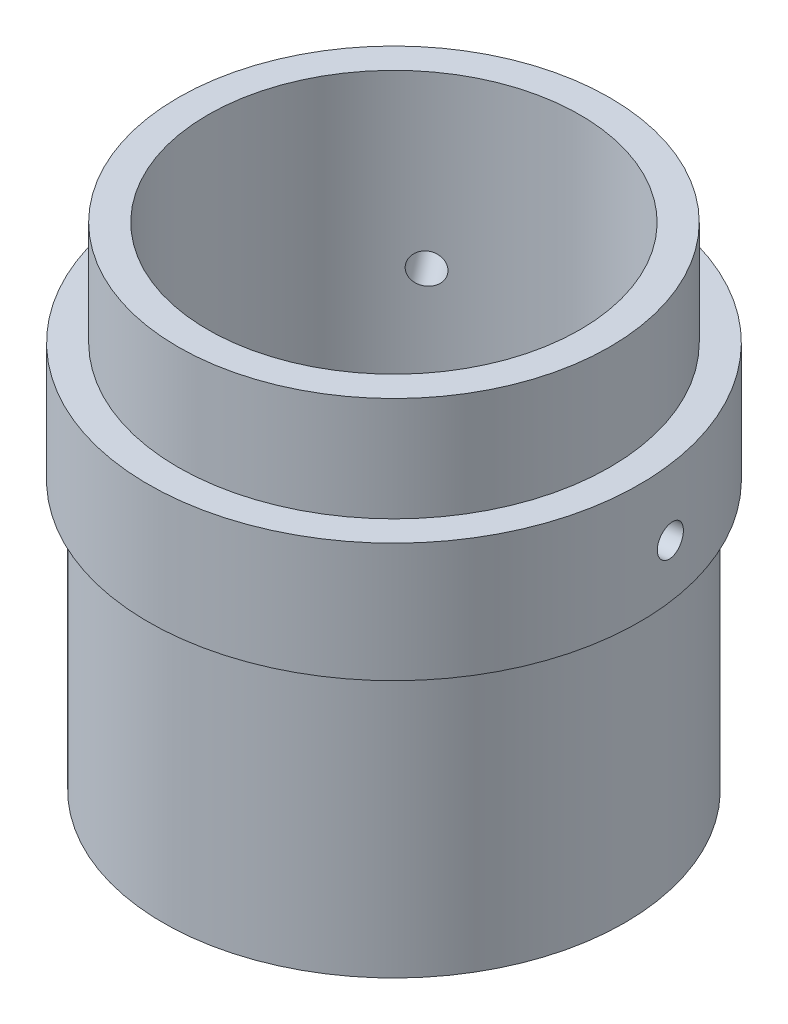
ISO-10303-21;
HEADER;
FILE_DESCRIPTION(('STEP AP214'),'2;1');
FILE_NAME('part.step','',(''),(''),'','','');
FILE_SCHEMA(('AUTOMOTIVE_DESIGN { 1 0 10303 214 1 1 1 1 }'));
ENDSEC;
DATA;
#1=APPLICATION_CONTEXT('core data for automotive mechanical design processes');
#2=APPLICATION_PROTOCOL_DEFINITION('international standard','automotive_design',2000,#1);
#3=PRODUCT_CONTEXT('',#1,'mechanical');
#4=PRODUCT('Part','Part','',(#3));
#5=PRODUCT_RELATED_PRODUCT_CATEGORY('part','',(#4));
#6=PRODUCT_DEFINITION_FORMATION('','',#4);
#7=PRODUCT_DEFINITION_CONTEXT('part definition',#1,'design');
#8=PRODUCT_DEFINITION('design','',#6,#7);
#9=PRODUCT_DEFINITION_SHAPE('','',#8);
#10=(LENGTH_UNIT() NAMED_UNIT(*) SI_UNIT(.MILLI.,.METRE.));
#11=(NAMED_UNIT(*) PLANE_ANGLE_UNIT() SI_UNIT($,.RADIAN.));
#12=(NAMED_UNIT(*) SI_UNIT($,.STERADIAN.) SOLID_ANGLE_UNIT());
#13=UNCERTAINTY_MEASURE_WITH_UNIT(LENGTH_MEASURE(1.E-05),#10,'distance_accuracy_value','');
#14=(GEOMETRIC_REPRESENTATION_CONTEXT(3) GLOBAL_UNCERTAINTY_ASSIGNED_CONTEXT((#13)) GLOBAL_UNIT_ASSIGNED_CONTEXT((#10,
#11,#12)) REPRESENTATION_CONTEXT('',''));
#15=CARTESIAN_POINT('',(0.,0.,0.));
#16=DIRECTION('',(0.,0.,1.));
#17=DIRECTION('',(1.,0.,0.));
#18=AXIS2_PLACEMENT_3D('',#15,#16,#17);
#19=CARTESIAN_POINT('',(3.37121447812988,0.,0.));
#20=DIRECTION('',(0.,1.,0.));
#21=DIRECTION('',(-1.,0.,0.));
#22=AXIS2_PLACEMENT_3D('',#19,#20,#21);
#23=PLANE('',#22);
#24=CARTESIAN_POINT('',(-9.12878552187012,0.,0.));
#25=DIRECTION('',(0.,1.,0.));
#26=DIRECTION('',(-1.,0.,0.));
#27=AXIS2_PLACEMENT_3D('',#24,#25,#26);
#28=CIRCLE('',#27,15.5);
#29=CARTESIAN_POINT('',(-24.6287855218701,0.,0.));
#30=VERTEX_POINT('',#29);
#31=EDGE_CURVE('E43',#30,#30,#28,.T.);
#32=ORIENTED_EDGE('',*,*,#31,.F.);
#33=EDGE_LOOP('',(#32));
#34=FACE_BOUND('',#33,.T.);
#35=CARTESIAN_POINT('',(-9.12878552187012,0.,0.));
#36=DIRECTION('',(0.,1.,0.));
#37=DIRECTION('',(-1.,0.,0.));
#38=AXIS2_PLACEMENT_3D('',#35,#36,#37);
#39=CIRCLE('',#38,12.5);
#40=CARTESIAN_POINT('',(-21.6287855218701,0.,0.));
#41=VERTEX_POINT('',#40);
#42=EDGE_CURVE('E81',#41,#41,#39,.T.);
#43=ORIENTED_EDGE('',*,*,#42,.T.);
#44=EDGE_LOOP('',(#43));
#45=FACE_BOUND('',#44,.T.);
#46=ADVANCED_FACE('F32',(#34,#45),#23,.F.);
#47=CARTESIAN_POINT('',(-9.12878552187013,76.3736030910314,0.));
#48=DIRECTION('',(0.,1.,0.));
#49=DIRECTION('',(-1.,0.,0.));
#50=AXIS2_PLACEMENT_3D('',#47,#48,#49);
#51=CYLINDRICAL_SURFACE('',#50,15.5);
#52=CARTESIAN_POINT('',(-9.12878552187012,18.,0.));
#53=DIRECTION('',(0.,1.,0.));
#54=DIRECTION('',(-1.,0.,0.));
#55=AXIS2_PLACEMENT_3D('',#52,#53,#54);
#56=CIRCLE('',#55,15.5);
#57=CARTESIAN_POINT('',(-24.6287855218701,18.,0.));
#58=VERTEX_POINT('',#57);
#59=EDGE_CURVE('E47',#58,#58,#56,.T.);
#60=ORIENTED_EDGE('',*,*,#59,.F.);
#61=EDGE_LOOP('',(#60));
#62=FACE_BOUND('',#61,.T.);
#63=ORIENTED_EDGE('',*,*,#31,.T.);
#64=EDGE_LOOP('',(#63));
#65=FACE_BOUND('',#64,.T.);
#66=ADVANCED_FACE('F96',(#62,#65),#51,.T.);
#67=CARTESIAN_POINT('',(6.37121447812988,18.,0.));
#68=DIRECTION('',(0.,1.,0.));
#69=DIRECTION('',(-1.,0.,0.));
#70=AXIS2_PLACEMENT_3D('',#67,#68,#69);
#71=PLANE('',#70);
#72=CARTESIAN_POINT('',(-9.12878552187012,18.,0.));
#73=DIRECTION('',(0.,1.,0.));
#74=DIRECTION('',(-1.,0.,0.));
#75=AXIS2_PLACEMENT_3D('',#72,#73,#74);
#76=CIRCLE('',#75,16.5);
#77=CARTESIAN_POINT('',(-25.6287855218701,18.,0.));
#78=VERTEX_POINT('',#77);
#79=EDGE_CURVE('E52',#78,#78,#76,.T.);
#80=ORIENTED_EDGE('',*,*,#79,.F.);
#81=EDGE_LOOP('',(#80));
#82=FACE_BOUND('',#81,.T.);
#83=ORIENTED_EDGE('',*,*,#59,.T.);
#84=EDGE_LOOP('',(#83));
#85=FACE_BOUND('',#84,.T.);
#86=ADVANCED_FACE('F92',(#82,#85),#71,.F.);
#87=CARTESIAN_POINT('',(-9.12878552187013,76.3736030910314,0.));
#88=DIRECTION('',(0.,1.,0.));
#89=DIRECTION('',(-1.,0.,0.));
#90=AXIS2_PLACEMENT_3D('',#87,#88,#89);
#91=CYLINDRICAL_SURFACE('',#90,16.5);
#92=CARTESIAN_POINT('',(-20.0438474923014,21.5379012642091,-12.3738200318917));
#93=CARTESIAN_POINT('',(-20.0438457555066,21.4803861928875,-12.3738219217379));
#94=CARTESIAN_POINT('',(-20.0401992436799,21.4228308320644,-12.3770411507515));
#95=CARTESIAN_POINT('',(-20.0256895268699,21.3093093072515,-12.3898173086874));
#96=CARTESIAN_POINT('',(-20.0148179184779,21.2533450730092,-12.3993816174603));
#97=CARTESIAN_POINT('',(-19.9861255996801,21.1446666108324,-12.4245131905844));
#98=CARTESIAN_POINT('',(-19.9683085531376,21.0919506862987,-12.4400772898733));
#99=CARTESIAN_POINT('',(-19.9261669753495,20.9912454321782,-12.4766713808522));
#100=CARTESIAN_POINT('',(-19.9018439357213,20.943255022627,-12.4977001196426));
#101=CARTESIAN_POINT('',(-19.847254415562,20.8532779256083,-12.5445492597814));
#102=CARTESIAN_POINT('',(-19.8169801859896,20.8112991904544,-12.5703759060471));
#103=CARTESIAN_POINT('',(-19.7512690097352,20.7346051091895,-12.6259531262803));
#104=CARTESIAN_POINT('',(-19.7158318479747,20.6998900658177,-12.6557038637136));
#105=CARTESIAN_POINT('',(-19.6406762480069,20.6386846039134,-12.7181972013824));
#106=CARTESIAN_POINT('',(-19.6009544392132,20.6122007250647,-12.7509421539363));
#107=CARTESIAN_POINT('',(-19.5183021992419,20.5682512541911,-12.8183768465374));
#108=CARTESIAN_POINT('',(-19.4753718020759,20.5507855665873,-12.8530665659688));
#109=CARTESIAN_POINT('',(-19.3875264009537,20.5253902201896,-12.9232887362927));
#110=CARTESIAN_POINT('',(-19.3426140561866,20.517448163979,-12.9588200300499));
#111=CARTESIAN_POINT('',(-19.2520052783366,20.5112872424984,-13.0297248853237));
#112=CARTESIAN_POINT('',(-19.2063088540077,20.5130682687424,-13.0650984485957));
#113=CARTESIAN_POINT('',(-19.1155015232757,20.5262927252617,-13.1346400991392));
#114=CARTESIAN_POINT('',(-19.0703898959213,20.5377228188528,-13.1688097825077));
#115=CARTESIAN_POINT('',(-18.9820025478966,20.5699002565371,-13.235073373942));
#116=CARTESIAN_POINT('',(-18.9387268379756,20.5906476551756,-13.2671672698544));
#117=CARTESIAN_POINT('',(-18.8552679240442,20.6408858652923,-13.328474258514));
#118=CARTESIAN_POINT('',(-18.8150868823905,20.6703827217543,-13.3576853408738));
#119=CARTESIAN_POINT('',(-18.7390655260273,20.7372781406607,-13.4124836469764));
#120=CARTESIAN_POINT('',(-18.7032252595615,20.7746767909134,-13.4380708304435));
#121=CARTESIAN_POINT('',(-18.6369316485549,20.8563895122316,-13.4850589420551));
#122=CARTESIAN_POINT('',(-18.6064875065533,20.9007151589561,-13.5064527252361));
#123=CARTESIAN_POINT('',(-18.5520157908802,20.9949830707463,-13.5445132454007));
#124=CARTESIAN_POINT('',(-18.5279882197294,21.0449253380183,-13.5611799805273));
#125=CARTESIAN_POINT('',(-18.4871145858838,21.1490162047707,-13.5894185801432));
#126=CARTESIAN_POINT('',(-18.4702689223704,21.2031650378606,-13.6009901614371));
#127=CARTESIAN_POINT('',(-18.4443062850666,21.3141285603353,-13.6187856576385));
#128=CARTESIAN_POINT('',(-18.4351892214615,21.3709432187321,-13.6250096346909));
#129=CARTESIAN_POINT('',(-18.4249899727218,21.485524008946,-13.6319705721927));
#130=CARTESIAN_POINT('',(-18.4238943889386,21.5432883925211,-13.6327166825819));
#131=CARTESIAN_POINT('',(-18.4297385020066,21.6582182427617,-13.6287301568724));
#132=CARTESIAN_POINT('',(-18.4366781575599,21.7153837125039,-13.6239975489321));
#133=CARTESIAN_POINT('',(-18.4583575815914,21.8274472312371,-13.6091607278883));
#134=CARTESIAN_POINT('',(-18.4730911985335,21.882347031665,-13.5990607510567));
#135=CARTESIAN_POINT('',(-18.5098789396347,21.9883748620207,-13.5737092357997));
#136=CARTESIAN_POINT('',(-18.5319331293803,22.0395028581512,-13.5584576512199));
#137=CARTESIAN_POINT('',(-18.5826929857307,22.1366101330863,-13.5231130939817));
#138=CARTESIAN_POINT('',(-18.6114074297594,22.1825824977257,-13.5030137311222));
#139=CARTESIAN_POINT('',(-18.6745689152621,22.2680038748753,-13.4584363725478));
#140=CARTESIAN_POINT('',(-18.7090160122145,22.307452824247,-13.4339583344576));
#141=CARTESIAN_POINT('',(-18.7826280872338,22.3787622495135,-13.3811574340932));
#142=CARTESIAN_POINT('',(-18.8217994692767,22.4106122466137,-13.352829346159));
#143=CARTESIAN_POINT('',(-18.9036272188774,22.4657479581146,-13.2930445672527));
#144=CARTESIAN_POINT('',(-18.946283565149,22.489033724821,-13.2615878953897));
#145=CARTESIAN_POINT('',(-19.0337701253029,22.5263617486263,-13.1963726884355));
#146=CARTESIAN_POINT('',(-19.0785987540232,22.5404106401808,-13.1626158247503));
#147=CARTESIAN_POINT('',(-19.1691389491471,22.5588878298647,-13.0936831705076));
#148=CARTESIAN_POINT('',(-19.2148505069842,22.5633162212905,-13.0585073937136));
#149=CARTESIAN_POINT('',(-19.3057627430099,22.5624257995672,-12.9877806442464));
#150=CARTESIAN_POINT('',(-19.3509641518516,22.5571233871422,-12.9522304031051));
#151=CARTESIAN_POINT('',(-19.4396679345154,22.536955874523,-12.8817279505795));
#152=CARTESIAN_POINT('',(-19.4831703053423,22.5220907574707,-12.8467757402497));
#153=CARTESIAN_POINT('',(-19.5672896204753,22.4832234886405,-12.778519808047));
#154=CARTESIAN_POINT('',(-19.6079065836217,22.459221396529,-12.745216075411));
#155=CARTESIAN_POINT('',(-19.6851784766268,22.4027638119583,-12.6812887977094));
#156=CARTESIAN_POINT('',(-19.7218335098509,22.3703085401152,-12.6506651827246));
#157=CARTESIAN_POINT('',(-19.7902916243533,22.297805354666,-12.5930257207957));
#158=CARTESIAN_POINT('',(-19.8220869989425,22.2577456024611,-12.566015612617));
#159=CARTESIAN_POINT('',(-19.8799596040329,22.1711861638508,-12.5165374470654));
#160=CARTESIAN_POINT('',(-19.9060354329557,22.1246849034943,-12.4940705031031));
#161=CARTESIAN_POINT('',(-19.9518376045054,22.0265098491104,-12.4544154988376));
#162=CARTESIAN_POINT('',(-19.971556087158,21.9748297548146,-12.4372339744143));
#163=CARTESIAN_POINT('',(-20.0040952536211,21.8678473252524,-12.4087916278477));
#164=CARTESIAN_POINT('',(-20.0169240188676,21.8125493195169,-12.3975238693854));
#165=CARTESIAN_POINT('',(-20.0320389272797,21.7204108987165,-12.3842287689742));
#166=CARTESIAN_POINT('',(-20.0364621253596,21.6841661097148,-12.3803314514798));
#167=CARTESIAN_POINT('',(-20.0423669597322,21.6112534316117,-12.3751264820255));
#168=CARTESIAN_POINT('',(-20.0438486000643,21.5745855430913,-12.3738188265096));
#169=CARTESIAN_POINT('',(-20.0438474923014,21.5379012642091,-12.3738200318917));
#170=B_SPLINE_CURVE_WITH_KNOTS('',3,(#92,#93,#94,#95,#96,#97,#98,#99,#100,#101,#102,#103,#104,
#105,#106,#107,#108,#109,#110,#111,#112,#113,#114,#115,#116,#117,#118,#119,#120,#121,#122,#123,
#124,#125,#126,#127,#128,#129,#130,#131,#132,#133,#134,#135,#136,#137,#138,#139,#140,#141,#142,
#143,#144,#145,#146,#147,#148,#149,#150,#151,#152,#153,#154,#155,#156,#157,#158,#159,#160,#161,
#162,#163,#164,#165,#166,#167,#168,#169),.UNSPECIFIED.,.T.,.F.,(4,2,2,2,2,2,2,2,2,2,2,2,2,2,2,2,
2,2,2,2,2,2,2,2,2,2,2,2,2,2,2,2,2,2,2,2,2,2,4),(0.,0.172411293738361,0.345023468408522,
0.517544709520043,0.690026430846816,0.862734246219719,1.03544925835097,1.20830114432747,
1.38115119830396,1.55377599907022,1.72639887376523,1.89878354362511,2.07116922267103,
2.24367428117314,2.41618125673106,2.58897965249882,2.76177811614958,2.93458618295462,
3.10739224151543,3.27990958813488,3.45242604808859,3.62480654876774,3.79718859387872,
3.96979912196398,4.14241132060714,4.3152601895838,4.48810800287648,4.66083153089476,
4.83355338389226,5.00598439121915,5.17841570252427,5.35084588783585,5.52327157341633,
5.6959679247472,5.8687065482704,6.04165792729834,6.21440599388875,6.32437356450772,
6.43434098411814),.UNSPECIFIED.);
#171=CARTESIAN_POINT('',(-20.0438474923014,21.5379012642091,-12.3738200318917));
#172=VERTEX_POINT('',#171);
#173=EDGE_CURVE('E10',#172,#172,#170,.T.);
#174=ORIENTED_EDGE('',*,*,#173,.T.);
#175=EDGE_LOOP('',(#174));
#176=FACE_BOUND('',#175,.T.);
#177=CARTESIAN_POINT('',(7.04478795282054,21.5379012642091,-3.26581093432894));
#178=CARTESIAN_POINT('',(7.0447887210779,21.4803861928875,-3.26580848529744));
#179=CARTESIAN_POINT('',(7.04575339927099,21.4228308320644,-3.26104089891353));
#180=CARTESIAN_POINT('',(7.04956301820125,21.3093093072515,-3.24208703658642));
#181=CARTESIAN_POINT('',(7.05241014837217,21.2533450730092,-3.22788979315246));
#182=CARTESIAN_POINT('',(7.05982856973585,21.1446666108325,-3.19047572961812));
#183=CARTESIAN_POINT('',(7.06439895183578,21.0919506862987,-3.16726366504739));
#184=CARTESIAN_POINT('',(7.07501957535782,20.9912454321782,-3.11247094263788));
#185=CARTESIAN_POINT('',(7.08106947754577,20.943255022627,-3.08089220302747));
#186=CARTESIAN_POINT('',(7.09434726297181,20.8532779256083,-3.01019172171967));
#187=CARTESIAN_POINT('',(7.10157667994626,20.8112991904544,-2.97106014669712));
#188=CARTESIAN_POINT('',(7.11685237641276,20.7346051091895,-2.88636398863167));
#189=CARTESIAN_POINT('',(7.12489868993103,20.6998900658177,-2.84079913759239));
#190=CARTESIAN_POINT('',(7.14144170793561,20.6386846039134,-2.74446580994925));
#191=CARTESIAN_POINT('',(7.14993876429611,20.6122007250647,-2.69369323817266));
#192=CARTESIAN_POINT('',(7.16701280119941,20.5682512541911,-2.58839695237727));
#193=CARTESIAN_POINT('',(7.17558978089416,20.5507855665873,-2.5338732781213));
#194=CARTESIAN_POINT('',(7.19248126374247,20.5253902201896,-2.42268584398185));
#195=CARTESIAN_POINT('',(7.200796094382,20.517448163979,-2.36602496559142));
#196=CARTESIAN_POINT('',(7.21689711137569,20.5112872424984,-2.25210303453055));
#197=CARTESIAN_POINT('',(7.22468330362719,20.5130682687424,-2.19484198856364));
#198=CARTESIAN_POINT('',(7.23950447425302,20.5262927252617,-2.08142970802809));
#199=CARTESIAN_POINT('',(7.2465404744122,20.5377228188528,-2.02527705104888));
#200=CARTESIAN_POINT('',(7.25973275392788,20.5699002565371,-1.91559956656919));
#201=CARTESIAN_POINT('',(7.26588902813401,20.5906476551756,-1.86207475445464));
#202=CARTESIAN_POINT('',(7.27725298077697,20.6408858652923,-1.75914372048794));
#203=CARTESIAN_POINT('',(7.28245999934578,20.6703827217544,-1.70974037648542));
#204=CARTESIAN_POINT('',(7.29190604633339,20.7372781406607,-1.61650479759349));
#205=CARTESIAN_POINT('',(7.29614506399425,20.7746767909134,-1.57267262462215));
#206=CARTESIAN_POINT('',(7.30369115682252,20.8563895122317,-1.49176661757602));
#207=CARTESIAN_POINT('',(7.30699664553954,20.9007151589561,-1.45470432561571));
#208=CARTESIAN_POINT('',(7.31272216504677,20.9949830707463,-1.38850017597279));
#209=CARTESIAN_POINT('',(7.31514219548913,21.0449253380183,-1.35935832140168));
#210=CARTESIAN_POINT('',(7.31916072320094,21.1490162047707,-1.30984141633839));
#211=CARTESIAN_POINT('',(7.32075917480679,21.2031650378606,-1.28946685314523));
#212=CARTESIAN_POINT('',(7.32318920793823,21.3141285603353,-1.25808480159022));
#213=CARTESIAN_POINT('',(7.32402079837559,21.3709432187321,-1.24707720437407));
#214=CARTESIAN_POINT('',(7.32494952271648,21.485524008946,-1.23476392711511));
#215=CARTESIAN_POINT('',(7.32504788137596,21.5432883925211,-1.23344206853232));
#216=CARTESIAN_POINT('',(7.32451750537267,21.6582182427617,-1.24049648176652));
#217=CARTESIAN_POINT('',(7.32388877444684,21.7153837125039,-1.24887270373929));
#218=CARTESIAN_POINT('',(7.32187942252734,21.8274472312371,-1.27506604621195));
#219=CARTESIAN_POINT('',(7.32049939448459,21.882347031665,-1.29287572118915));
#220=CARTESIAN_POINT('',(7.31693820879815,21.9883748620207,-1.33741059715916));
#221=CARTESIAN_POINT('',(7.3147570439769,22.0395028581512,-1.3641358780286));
#222=CARTESIAN_POINT('',(7.30952768769832,22.1366101330863,-1.4257674817396));
#223=CARTESIAN_POINT('',(7.30647835087646,22.1825824977257,-1.4606846011538));
#224=CARTESIAN_POINT('',(7.29945396866877,22.2680038748753,-1.53767273142706));
#225=CARTESIAN_POINT('',(7.29547891432403,22.307452824247,-1.57974381151959));
#226=CARTESIAN_POINT('',(7.28655803077544,22.3787622495135,-1.6698941886938));
#227=CARTESIAN_POINT('',(7.28161087800523,22.4106122466137,-1.71798164461139));
#228=CARTESIAN_POINT('',(7.27074961551303,22.4657479581146,-1.81873894395327));
#229=CARTESIAN_POINT('',(7.26483551169698,22.489033724821,-1.87140875938858));
#230=CARTESIAN_POINT('',(7.25210076583852,22.5263617486263,-1.97978194644868));
#231=CARTESIAN_POINT('',(7.24528077869519,22.5404106401808,-2.03548310957987));
#232=CARTESIAN_POINT('',(7.23085344653276,22.5588878298647,-2.14835954574218));
#233=CARTESIAN_POINT('',(7.22324610914984,22.5633162212905,-2.20553480447257));
#234=CARTESIAN_POINT('',(7.20745106539696,22.5624257995673,-2.31963048511938));
#235=CARTESIAN_POINT('',(7.19926435787876,22.5571233871422,-2.37655117403371));
#236=CARTESIAN_POINT('',(7.18255933429447,22.536955874523,-2.48862212949515));
#237=CARTESIAN_POINT('',(7.1740410176438,22.5220907574708,-2.543772392921));
#238=CARTESIAN_POINT('',(7.15698930396383,22.4832234886405,-2.65074982287646));
#239=CARTESIAN_POINT('',(7.14845590703336,22.459221396529,-2.70257701110387));
#240=CARTESIAN_POINT('',(7.13172920705164,22.4027638119583,-2.80146007229558));
#241=CARTESIAN_POINT('',(7.12353589513112,22.3703085401152,-2.84851606973664));
#242=CARTESIAN_POINT('',(7.1078477140914,22.297805354666,-2.93662226695536));
#243=CARTESIAN_POINT('',(7.10035396154428,22.2577456024611,-2.97766292316181));
#244=CARTESIAN_POINT('',(7.08644091578919,22.1711861638508,-3.05252115212906));
#245=CARTESIAN_POINT('',(7.08002188603375,22.1246849034943,-3.08633695438208));
#246=CARTESIAN_POINT('',(7.06858073072758,22.0265098491104,-3.14583030062533));
#247=CARTESIAN_POINT('',(7.06356033542751,21.9748297548146,-3.17149776973829));
#248=CARTESIAN_POINT('',(7.05519812398918,21.8678473252524,-3.21389868779655));
#249=CARTESIAN_POINT('',(7.05185434154032,21.8125493195169,-3.23064260363038));
#250=CARTESIAN_POINT('',(7.04789790104444,21.7204108987165,-3.25038004849667));
#251=CARTESIAN_POINT('',(7.0467343241276,21.6841661097148,-3.25615930914705));
#252=CARTESIAN_POINT('',(7.0451791055406,21.6112534316117,-3.26387553044604));
#253=CARTESIAN_POINT('',(7.04478746281042,21.5745855430913,-3.2658124963709));
#254=CARTESIAN_POINT('',(7.04478795282054,21.5379012642091,-3.26581093432894));
#255=B_SPLINE_CURVE_WITH_KNOTS('',3,(#177,#178,#179,#180,#181,#182,#183,#184,#185,#186,#187,
#188,#189,#190,#191,#192,#193,#194,#195,#196,#197,#198,#199,#200,#201,#202,#203,#204,#205,#206,
#207,#208,#209,#210,#211,#212,#213,#214,#215,#216,#217,#218,#219,#220,#221,#222,#223,#224,#225,
#226,#227,#228,#229,#230,#231,#232,#233,#234,#235,#236,#237,#238,#239,#240,#241,#242,#243,#244,
#245,#246,#247,#248,#249,#250,#251,#252,#253,#254),.UNSPECIFIED.,.T.,.F.,(4,2,2,2,2,2,2,2,2,2,2,
2,2,2,2,2,2,2,2,2,2,2,2,2,2,2,2,2,2,2,2,2,2,2,2,2,2,2,4),(0.,0.172411293738361,
0.345023468408522,0.517544709520048,0.690026430846813,0.862734246219722,1.03544925835097,
1.20830114432747,1.38115119830396,1.55377599907022,1.72639887376523,1.89878354362511,
2.07116922267103,2.24367428117314,2.41618125673105,2.58897965249882,2.76177811614958,
2.93458618295462,3.10739224151543,3.27990958813488,3.45242604808859,3.62480654876774,
3.79718859387873,3.96979912196398,4.14241132060714,4.3152601895838,4.48810800287648,
4.66083153089476,4.83355338389226,5.00598439121915,5.17841570252427,5.35084588783585,
5.52327157341632,5.69596792474719,5.8687065482704,6.04165792729834,6.21440599388875,
6.32437356450772,6.43434098411814),.UNSPECIFIED.);
#256=CARTESIAN_POINT('',(7.04478795282054,21.5379012642091,-3.26581093432894));
#257=VERTEX_POINT('',#256);
#258=EDGE_CURVE('E62',#257,#257,#255,.T.);
#259=ORIENTED_EDGE('',*,*,#258,.T.);
#260=EDGE_LOOP('',(#259));
#261=FACE_BOUND('',#260,.T.);
#262=CARTESIAN_POINT('',(-9.12878552187012,26.,0.));
#263=DIRECTION('',(0.,1.,0.));
#264=DIRECTION('',(-1.,0.,0.));
#265=AXIS2_PLACEMENT_3D('',#262,#263,#264);
#266=CIRCLE('',#265,16.5);
#267=CARTESIAN_POINT('',(-25.6287855218701,26.,0.));
#268=VERTEX_POINT('',#267);
#269=EDGE_CURVE('E123',#268,#268,#266,.T.);
#270=ORIENTED_EDGE('',*,*,#269,.F.);
#271=EDGE_LOOP('',(#270));
#272=FACE_BOUND('',#271,.T.);
#273=ORIENTED_EDGE('',*,*,#79,.T.);
#274=EDGE_LOOP('',(#273));
#275=FACE_BOUND('',#274,.T.);
#276=ADVANCED_FACE('F86',(#176,#261,#272,#275),#91,.T.);
#277=CARTESIAN_POINT('',(7.37121447812988,26.,0.));
#278=DIRECTION('',(0.,-1.,0.));
#279=DIRECTION('',(1.,0.,0.));
#280=AXIS2_PLACEMENT_3D('',#277,#278,#279);
#281=PLANE('',#280);
#282=CARTESIAN_POINT('',(-9.12878552187012,26.,0.));
#283=DIRECTION('',(0.,1.,0.));
#284=DIRECTION('',(-1.,0.,0.));
#285=AXIS2_PLACEMENT_3D('',#282,#283,#284);
#286=CIRCLE('',#285,14.5);
#287=CARTESIAN_POINT('',(-23.6287855218701,26.,0.));
#288=VERTEX_POINT('',#287);
#289=EDGE_CURVE('E118',#288,#288,#286,.T.);
#290=ORIENTED_EDGE('',*,*,#289,.F.);
#291=EDGE_LOOP('',(#290));
#292=FACE_BOUND('',#291,.T.);
#293=ORIENTED_EDGE('',*,*,#269,.T.);
#294=EDGE_LOOP('',(#293));
#295=FACE_BOUND('',#294,.T.);
#296=ADVANCED_FACE('F91',(#292,#295),#281,.F.);
#297=CARTESIAN_POINT('',(-9.12878552187013,76.3736030910314,0.));
#298=DIRECTION('',(0.,1.,0.));
#299=DIRECTION('',(-1.,0.,0.));
#300=AXIS2_PLACEMENT_3D('',#297,#298,#299);
#301=CYLINDRICAL_SURFACE('',#300,14.5);
#302=CARTESIAN_POINT('',(-9.12878552187012,33.,0.));
#303=DIRECTION('',(0.,1.,0.));
#304=DIRECTION('',(-1.,0.,0.));
#305=AXIS2_PLACEMENT_3D('',#302,#303,#304);
#306=CIRCLE('',#305,14.5);
#307=CARTESIAN_POINT('',(-23.6287855218701,33.,0.));
#308=VERTEX_POINT('',#307);
#309=EDGE_CURVE('E114',#308,#308,#306,.T.);
#310=ORIENTED_EDGE('',*,*,#309,.F.);
#311=EDGE_LOOP('',(#310));
#312=FACE_BOUND('',#311,.T.);
#313=ORIENTED_EDGE('',*,*,#289,.T.);
#314=EDGE_LOOP('',(#313));
#315=FACE_BOUND('',#314,.T.);
#316=ADVANCED_FACE('F132',(#312,#315),#301,.T.);
#317=CARTESIAN_POINT('',(5.37121447812988,33.,0.));
#318=DIRECTION('',(0.,-1.,0.));
#319=DIRECTION('',(1.,0.,0.));
#320=AXIS2_PLACEMENT_3D('',#317,#318,#319);
#321=PLANE('',#320);
#322=CARTESIAN_POINT('',(-9.12878552187012,33.,0.));
#323=DIRECTION('',(0.,1.,0.));
#324=DIRECTION('',(-1.,0.,0.));
#325=AXIS2_PLACEMENT_3D('',#322,#323,#324);
#326=CIRCLE('',#325,12.5);
#327=CARTESIAN_POINT('',(-21.6287855218701,33.,0.));
#328=VERTEX_POINT('',#327);
#329=EDGE_CURVE('E112',#328,#328,#326,.T.);
#330=ORIENTED_EDGE('',*,*,#329,.F.);
#331=EDGE_LOOP('',(#330));
#332=FACE_BOUND('',#331,.T.);
#333=ORIENTED_EDGE('',*,*,#309,.T.);
#334=EDGE_LOOP('',(#333));
#335=FACE_BOUND('',#334,.T.);
#336=ADVANCED_FACE('F137',(#332,#335),#321,.F.);
#337=CARTESIAN_POINT('',(-9.12878552187013,76.3736030910314,0.));
#338=DIRECTION('',(0.,1.,0.));
#339=DIRECTION('',(-1.,0.,0.));
#340=AXIS2_PLACEMENT_3D('',#337,#338,#339);
#341=CYLINDRICAL_SURFACE('',#340,12.5);
#342=CARTESIAN_POINT('',(-17.5829518742101,21.5379012642091,-9.20744651284835));
#343=CARTESIAN_POINT('',(-17.5829502333212,21.5953720265285,-9.20744849500437));
#344=CARTESIAN_POINT('',(-17.5793693004798,21.6528819950403,-9.21073997108212));
#345=CARTESIAN_POINT('',(-17.565116562989,21.7663109416525,-9.22379576744507));
#346=CARTESIAN_POINT('',(-17.5544367078863,21.8222280382092,-9.23356743649146));
#347=CARTESIAN_POINT('',(-17.5262363851181,21.9308119770678,-9.2592213592086));
#348=CARTESIAN_POINT('',(-17.5087197761415,21.9834806334173,-9.27510016591489));
#349=CARTESIAN_POINT('',(-17.4672576090095,22.0841006762016,-9.31239265602088));
#350=CARTESIAN_POINT('',(-17.4433134323359,22.1320530732829,-9.33380515002431));
#351=CARTESIAN_POINT('',(-17.3894970103683,22.2220114312462,-9.38146772686584));
#352=CARTESIAN_POINT('',(-17.3596117965819,22.2640040327933,-9.40772838349152));
#353=CARTESIAN_POINT('',(-17.2946634379817,22.3407360394056,-9.46415789428297));
#354=CARTESIAN_POINT('',(-17.2596000678142,22.3754751286388,-9.49432691853408));
#355=CARTESIAN_POINT('',(-17.1851110804394,22.4367582588883,-9.55761511453177));
#356=CARTESIAN_POINT('',(-17.1456794291835,22.4632907672526,-9.5907383544146));
#357=CARTESIAN_POINT('',(-17.0635094613153,22.5073338037272,-9.65883016209351));
#358=CARTESIAN_POINT('',(-17.0207712009596,22.5248444852907,-9.69379869849155));
#359=CARTESIAN_POINT('',(-16.933232775416,22.5503084209187,-9.76441276132843));
#360=CARTESIAN_POINT('',(-16.8884375049297,22.5582832547007,-9.80005657305103));
#361=CARTESIAN_POINT('',(-16.7979385768572,22.5645158238084,-9.8710383405013));
#362=CARTESIAN_POINT('',(-16.7522349356966,22.5627737346805,-9.90637630174293));
#363=CARTESIAN_POINT('',(-16.6613404485643,22.5496395685354,-9.97566414796064));
#364=CARTESIAN_POINT('',(-16.6161486340384,22.5382706977119,-10.009617165338));
#365=CARTESIAN_POINT('',(-16.5274928667917,22.50624176708,-10.0753251135681));
#366=CARTESIAN_POINT('',(-16.4840289300717,22.485581621252,-10.1070800240675));
#367=CARTESIAN_POINT('',(-16.4000849153771,22.4355307124419,-10.1676393496013));
#368=CARTESIAN_POINT('',(-16.3596084646194,22.4061295474551,-10.1964401939975));
#369=CARTESIAN_POINT('',(-16.2829401242204,22.3394387451493,-10.2503791437047));
#370=CARTESIAN_POINT('',(-16.2467483187066,22.3021489529795,-10.2755171770999));
#371=CARTESIAN_POINT('',(-16.1796861805263,22.2206086053245,-10.3216503081848));
#372=CARTESIAN_POINT('',(-16.14883182284,22.1763378867781,-10.3426329951629));
#373=CARTESIAN_POINT('',(-16.0935705495231,22.0821626644373,-10.3799269990348));
#374=CARTESIAN_POINT('',(-16.0691636389657,22.03225815621,-10.3962383122528));
#375=CARTESIAN_POINT('',(-16.0275997279991,21.9282178539796,-10.4238662946305));
#376=CARTESIAN_POINT('',(-16.0104435817347,21.8740815623591,-10.4351823753553));
#377=CARTESIAN_POINT('',(-15.9839636014723,21.7631211365984,-10.4525971352235));
#378=CARTESIAN_POINT('',(-15.9746396081079,21.7062970571733,-10.4586959205268));
#379=CARTESIAN_POINT('',(-15.9641573663225,21.5917510583575,-10.4655497535493));
#380=CARTESIAN_POINT('',(-15.9629754404739,21.5340322319744,-10.4663202960166));
#381=CARTESIAN_POINT('',(-15.9687549292473,21.4191796820746,-10.4625441436389));
#382=CARTESIAN_POINT('',(-15.9757162703606,21.362045953281,-10.4579974967917));
#383=CARTESIAN_POINT('',(-15.9975295682019,21.2500662954504,-10.4436834147594));
#384=CARTESIAN_POINT('',(-16.0123705266948,21.1952172922306,-10.4339232563895));
#385=CARTESIAN_POINT('',(-16.0494382566641,21.0892688442107,-10.409373518167));
#386=CARTESIAN_POINT('',(-16.0716651429501,21.0381694577113,-10.3945838601339));
#387=CARTESIAN_POINT('',(-16.1228321044753,20.9410416703652,-10.3602249316021));
#388=CARTESIAN_POINT('',(-16.1517875067987,20.8950252065766,-10.340644743146));
#389=CARTESIAN_POINT('',(-16.2154470654604,20.8094901203647,-10.2971214904927));
#390=CARTESIAN_POINT('',(-16.2501513176083,20.7699716062573,-10.2731783535823));
#391=CARTESIAN_POINT('',(-16.3243001394193,20.6984580095511,-10.2213803199919));
#392=CARTESIAN_POINT('',(-16.3637559069445,20.6664812462252,-10.1935161555706));
#393=CARTESIAN_POINT('',(-16.4461122352152,20.6110845246902,-10.1345592368643));
#394=CARTESIAN_POINT('',(-16.4890127624727,20.58766448331,-10.1034665139644));
#395=CARTESIAN_POINT('',(-16.5768957666304,20.5500775049119,-10.038855619548));
#396=CARTESIAN_POINT('',(-16.6218756174287,20.535899220328,-10.0053404788305));
#397=CARTESIAN_POINT('',(-16.7126261057413,20.5171611338985,-9.93672965663628));
#398=CARTESIAN_POINT('',(-16.7583967287944,20.5126011563451,-9.90163400404453));
#399=CARTESIAN_POINT('',(-16.8492674106097,20.5132311466402,-9.83094418486809));
#400=CARTESIAN_POINT('',(-16.8943690424306,20.5183925562831,-9.79535178239597));
#401=CARTESIAN_POINT('',(-16.9827794957163,20.5382592785208,-9.72460720568518));
#402=CARTESIAN_POINT('',(-17.0260883146835,20.5529646044107,-9.68945503205983));
#403=CARTESIAN_POINT('',(-17.1097459842379,20.5914945228218,-9.62066552683089));
#404=CARTESIAN_POINT('',(-17.1500949930522,20.6153186274422,-9.58702811428748));
#405=CARTESIAN_POINT('',(-17.2267930462481,20.6714065185757,-9.52233136210942));
#406=CARTESIAN_POINT('',(-17.2631421567801,20.7036701654857,-9.49127197984131));
#407=CARTESIAN_POINT('',(-17.3310333477016,20.7758284435555,-9.43266404652465));
#408=CARTESIAN_POINT('',(-17.3625616837652,20.8157441880255,-9.4051255690624));
#409=CARTESIAN_POINT('',(-17.4199323418902,20.9020358775787,-9.3545897924279));
#410=CARTESIAN_POINT('',(-17.4457732840562,20.9484133859901,-9.33159359545806));
#411=CARTESIAN_POINT('',(-17.4911882033574,21.0463994050155,-9.29091790116611));
#412=CARTESIAN_POINT('',(-17.5107506461259,21.0980173165658,-9.27324819282699));
#413=CARTESIAN_POINT('',(-17.5430674716718,21.2049151572874,-9.24393529290318));
#414=CARTESIAN_POINT('',(-17.5558296925216,21.2601907874879,-9.23228516350241));
#415=CARTESIAN_POINT('',(-17.5710018100423,21.3528113969789,-9.21840793776565));
#416=CARTESIAN_POINT('',(-17.5754781307309,21.3895604560239,-9.21430413283112));
#417=CARTESIAN_POINT('',(-17.5814536901436,21.4635012876101,-9.20882278224624));
#418=CARTESIAN_POINT('',(-17.5829529365681,21.5006930590059,-9.2074452295442));
#419=CARTESIAN_POINT('',(-17.5829518742101,21.5379012642091,-9.20744651284835));
#420=B_SPLINE_CURVE_WITH_KNOTS('',3,(#342,#343,#344,#345,#346,#347,#348,#349,#350,#351,#352,
#353,#354,#355,#356,#357,#358,#359,#360,#361,#362,#363,#364,#365,#366,#367,#368,#369,#370,#371,
#372,#373,#374,#375,#376,#377,#378,#379,#380,#381,#382,#383,#384,#385,#386,#387,#388,#389,#390,
#391,#392,#393,#394,#395,#396,#397,#398,#399,#400,#401,#402,#403,#404,#405,#406,#407,#408,#409,
#410,#411,#412,#413,#414,#415,#416,#417,#418,#419),.UNSPECIFIED.,.T.,.F.,(4,2,2,2,2,2,2,2,2,2,2,
2,2,2,2,2,2,2,2,2,2,2,2,2,2,2,2,2,2,2,2,2,2,2,2,2,2,2,4),(0.,0.172276434326407,
0.344748570893415,0.517123503994388,0.689461418048334,0.862179737327148,1.03490557553238,
1.20787305277124,1.38083758788803,1.55340995725646,1.7259792089321,1.89813364781562,
2.07028968055428,2.24265140842921,2.41501652001304,2.58788891518235,2.76076144637815,
2.93365433640232,3.10654370836728,3.27893009873217,3.45131493299033,3.62345978555844,
3.795607314136,3.96815089478144,4.14069735130674,4.31365871146284,4.48661839039294,
4.65936529731988,4.83210904846757,5.00434612721893,5.17658344590318,5.34881155030468,
5.52103680596429,5.69374428081058,5.86649361246725,6.03955851278975,6.21242350114788,
6.32396045040318,6.43549711115728),.UNSPECIFIED.);
#421=CARTESIAN_POINT('',(-17.5829518742101,21.5379012642091,-9.20744651284835));
#422=VERTEX_POINT('',#421);
#423=EDGE_CURVE('E63',#422,#422,#420,.T.);
#424=ORIENTED_EDGE('',*,*,#423,.T.);
#425=EDGE_LOOP('',(#424));
#426=FACE_BOUND('',#425,.T.);
#427=CARTESIAN_POINT('',(3.07218023841297,21.5379012642091,-2.71779957252178));
#428=CARTESIAN_POINT('',(3.07218113456603,21.5953720265285,-2.71779716039237));
#429=CARTESIAN_POINT('',(3.07324117004457,21.6528819950403,-2.71305024354353));
#430=CARTESIAN_POINT('',(3.07742145261616,21.7663109416525,-2.69417911262161));
#431=CARTESIAN_POINT('',(3.08054403869636,21.8222280382092,-2.68004425227075));
#432=CARTESIAN_POINT('',(3.08866082609201,21.9308119770678,-2.64279509499997));
#433=CARTESIAN_POINT('',(3.09365397159313,21.9834806334173,-2.61968586328491));
#434=CARTESIAN_POINT('',(3.1052191318293,22.0841006762017,-2.56513232819966));
#435=CARTESIAN_POINT('',(3.11179080725788,22.1320530732829,-2.53368981592593));
#436=CARTESIAN_POINT('',(3.12615959862864,22.2220114312462,-2.46325213894039));
#437=CARTESIAN_POINT('',(3.13395938749335,22.2640040327933,-2.42424045629103));
#438=CARTESIAN_POINT('',(3.15035459806176,22.3407360394056,-2.33977877241341));
#439=CARTESIAN_POINT('',(3.15895005438688,22.3754751286388,-2.29432849098052));
#440=CARTESIAN_POINT('',(3.17651474619316,22.4367582588883,-2.19817503761292));
#441=CARTESIAN_POINT('',(3.18548448775939,22.4632907672526,-2.14746460597073));
#442=CARTESIAN_POINT('',(3.2033687390648,22.5073338037272,-2.04225742252921));
#443=CARTESIAN_POINT('',(3.21228324974085,22.5248444852907,-1.98776073514867));
#444=CARTESIAN_POINT('',(3.2296676092502,22.5503084209187,-1.87664320340214));
#445=CARTESIAN_POINT('',(3.23813842044653,22.5582832547007,-1.82002745533032));
#446=CARTESIAN_POINT('',(3.25436097022774,22.5645158238084,-1.70616220087915));
#447=CARTESIAN_POINT('',(3.26211272180061,22.5627737346805,-1.64891270596776));
#448=CARTESIAN_POINT('',(3.27667051323253,22.5496395685354,-1.5355518479384));
#449=CARTESIAN_POINT('',(3.28347878155349,22.5382706977119,-1.47943807982724));
#450=CARTESIAN_POINT('',(3.29605565032798,22.50624176708,-1.36980595908449));
#451=CARTESIAN_POINT('',(3.30182424115537,22.485581621252,-1.3162876304868));
#452=CARTESIAN_POINT('',(3.3122981481564,22.4355307124419,-1.21331031849869));
#453=CARTESIAN_POINT('',(3.3170021856751,22.4061295474551,-1.16385626168945));
#454=CARTESIAN_POINT('',(3.32538051617548,22.3394387451493,-1.07049005638424));
#455=CARTESIAN_POINT('',(3.32905478893999,22.3021489529795,-1.02657801670298));
#456=CARTESIAN_POINT('',(3.33547618332552,22.2206086053245,-0.945433935864261));
#457=CARTESIAN_POINT('',(3.33822054444505,22.1763378867781,-0.908221934801386));
#458=CARTESIAN_POINT('',(3.34288746254845,22.0821626644373,-0.841717266327497));
#459=CARTESIAN_POINT('',(3.34481001888568,22.03225815621,-0.812424605147918));
#460=CARTESIAN_POINT('',(3.34795459799671,21.9282178539796,-0.762615211181335));
#461=CARTESIAN_POINT('',(3.34917653824352,21.8740815623591,-0.742099512322922));
#462=CARTESIAN_POINT('',(3.35101817255893,21.7631211365984,-0.710459796789894));
#463=CARTESIAN_POINT('',(3.35163787888167,21.7062970571733,-0.69933558901994));
#464=CARTESIAN_POINT('',(3.35233235149974,21.5917510583575,-0.686830784833922));
#465=CARTESIAN_POINT('',(3.35240869792683,21.5340322319744,-0.685421935790029));
#466=CARTESIAN_POINT('',(3.35202819842585,21.4191796820746,-0.692315196077526));
#467=CARTESIAN_POINT('',(3.35157135731083,21.362045953281,-0.700617217749629));
#468=CARTESIAN_POINT('',(3.35008164755969,21.2500662954504,-0.726665128836684));
#469=CARTESIAN_POINT('',(3.34904958171277,21.1952172922306,-0.744397855092977));
#470=CARTESIAN_POINT('',(3.34632274974047,21.0892688442107,-0.788774320018249));
#471=CARTESIAN_POINT('',(3.34462797331361,21.0381694577113,-0.815418197205547));
#472=CARTESIAN_POINT('',(3.34045574912082,20.9410416703652,-0.876909549986701));
#473=CARTESIAN_POINT('',(3.33797650966868,20.8950252065766,-0.911775758203638));
#474=CARTESIAN_POINT('',(3.33211404654636,20.8094901203647,-0.988668179525067));
#475=CARTESIAN_POINT('',(3.32873080780968,20.7699716062573,-1.03069451195966));
#476=CARTESIAN_POINT('',(3.32094680575977,20.6984580095511,-1.12080829210386));
#477=CARTESIAN_POINT('',(3.31654361527834,20.6664812462252,-1.16891007131715));
#478=CARTESIAN_POINT('',(3.3066635900851,20.6110845246902,-1.26971120311515));
#479=CARTESIAN_POINT('',(3.30118676580979,20.58766448331,-1.3224105110058));
#480=CARTESIAN_POINT('',(3.28917359196278,20.5500775049119,-1.43082487237547));
#481=CARTESIAN_POINT('',(3.28263855408911,20.535899220328,-1.486536136184));
#482=CARTESIAN_POINT('',(3.26859508325073,20.5171611338985,-1.59943377556567));
#483=CARTESIAN_POINT('',(3.26108666807042,20.5126011563451,-1.65662012417255));
#484=CARTESIAN_POINT('',(3.24530282978235,20.5132311466402,-1.77066135267205));
#485=CARTESIAN_POINT('',(3.23702972097022,20.5183925562831,-1.82751671281713));
#486=CARTESIAN_POINT('',(3.21996834700154,20.5382592785208,-1.93945469967802));
#487=CARTESIAN_POINT('',(3.21118008112738,20.5529646044107,-1.99453732392424));
#488=CARTESIAN_POINT('',(3.19343545686252,20.5914945228218,-2.10138174359419));
#489=CARTESIAN_POINT('',(3.18447910748953,20.6153186274422,-2.15314371651664));
#490=CARTESIAN_POINT('',(3.16679910315891,20.6714065185757,-2.2519145550941));
#491=CARTESIAN_POINT('',(3.15807544435486,20.7036701654857,-2.2989234993538));
#492=CARTESIAN_POINT('',(3.14126508070011,20.7758284435555,-2.38702296204338));
#493=CARTESIAN_POINT('',(3.13318022766805,20.8157441880255,-2.42809654074463));
#494=CARTESIAN_POINT('',(3.11810029036507,20.9020358775787,-2.50304887642993));
#495=CARTESIAN_POINT('',(3.11110547068177,20.9484133859901,-2.53692588728834));
#496=CARTESIAN_POINT('',(3.09858674575898,21.0463994050155,-2.59659420825998));
#497=CARTESIAN_POINT('',(3.09306555084409,21.0980173165658,-2.62237063482714));
#498=CARTESIAN_POINT('',(3.08383824762444,21.2049151572874,-2.66501427668148));
#499=CARTESIAN_POINT('',(3.08013005003088,21.260190787488,-2.68189174884648));
#500=CARTESIAN_POINT('',(3.07569807876913,21.3528113969789,-2.70196980091696));
#501=CARTESIAN_POINT('',(3.07438223978798,21.3895604560239,-2.70789831081609));
#502=CARTESIAN_POINT('',(3.07262303064077,21.4635012876101,-2.71581397236174));
#503=CARTESIAN_POINT('',(3.07217965821801,21.5006930590059,-2.71780113420293));
#504=CARTESIAN_POINT('',(3.07218023841297,21.5379012642091,-2.71779957252178));
#505=B_SPLINE_CURVE_WITH_KNOTS('',3,(#427,#428,#429,#430,#431,#432,#433,#434,#435,#436,#437,
#438,#439,#440,#441,#442,#443,#444,#445,#446,#447,#448,#449,#450,#451,#452,#453,#454,#455,#456,
#457,#458,#459,#460,#461,#462,#463,#464,#465,#466,#467,#468,#469,#470,#471,#472,#473,#474,#475,
#476,#477,#478,#479,#480,#481,#482,#483,#484,#485,#486,#487,#488,#489,#490,#491,#492,#493,#494,
#495,#496,#497,#498,#499,#500,#501,#502,#503,#504),.UNSPECIFIED.,.T.,.F.,(4,2,2,2,2,2,2,2,2,2,2,
2,2,2,2,2,2,2,2,2,2,2,2,2,2,2,2,2,2,2,2,2,2,2,2,2,2,2,4),(0.,0.172276434326407,
0.344748570893415,0.517123503994392,0.689461418048334,0.862179737327147,1.03490557553238,
1.20787305277124,1.38083758788803,1.55340995725646,1.7259792089321,1.89813364781562,
2.07028968055428,2.2426514084292,2.41501652001303,2.58788891518235,2.76076144637815,
2.93365433640231,3.10654370836728,3.27893009873216,3.45131493299033,3.62345978555844,
3.795607314136,3.96815089478144,4.14069735130674,4.31365871146283,4.48661839039294,
4.65936529731988,4.83210904846757,5.00434612721893,5.17658344590318,5.34881155030468,
5.52103680596429,5.69374428081058,5.86649361246725,6.03955851278976,6.21242350114789,
6.32396045040319,6.43549711115728),.UNSPECIFIED.);
#506=CARTESIAN_POINT('',(3.07218023841297,21.5379012642091,-2.71779957252178));
#507=VERTEX_POINT('',#506);
#508=EDGE_CURVE('E55',#507,#507,#505,.T.);
#509=ORIENTED_EDGE('',*,*,#508,.T.);
#510=EDGE_LOOP('',(#509));
#511=FACE_BOUND('',#510,.T.);
#512=ORIENTED_EDGE('',*,*,#42,.F.);
#513=EDGE_LOOP('',(#512));
#514=FACE_BOUND('',#513,.T.);
#515=ORIENTED_EDGE('',*,*,#329,.T.);
#516=EDGE_LOOP('',(#515));
#517=FACE_BOUND('',#516,.T.);
#518=ADVANCED_FACE('F64',(#426,#511,#514,#517),#341,.F.);
#519=CARTESIAN_POINT('',(7.21642664692983,21.5379012642091,-2.25478139891969));
#520=DIRECTION('',(0.990618919321209,0.,-0.136653418116345));
#521=DIRECTION('',(-0.136653418116345,0.,-0.990618919321209));
#522=AXIS2_PLACEMENT_3D('',#519,#520,#521);
#523=CYLINDRICAL_SURFACE('',#522,1.025);
#524=ORIENTED_EDGE('',*,*,#508,.F.);
#525=EDGE_LOOP('',(#524));
#526=FACE_BOUND('',#525,.T.);
#527=ORIENTED_EDGE('',*,*,#258,.F.);
#528=EDGE_LOOP('',(#527));
#529=FACE_BOUND('',#528,.T.);
#530=ADVANCED_FACE('F67',(#526,#529),#523,.F.);
#531=CARTESIAN_POINT('',(-19.2540895777152,21.5379012642091,-13.0279782689674));
#532=DIRECTION('',(-0.613654791263339,0.,-0.789574440543479));
#533=DIRECTION('',(-0.789574440543479,0.,0.613654791263339));
#534=AXIS2_PLACEMENT_3D('',#531,#532,#533);
#535=CYLINDRICAL_SURFACE('',#534,1.025);
#536=ORIENTED_EDGE('',*,*,#173,.F.);
#537=EDGE_LOOP('',(#536));
#538=FACE_BOUND('',#537,.T.);
#539=ORIENTED_EDGE('',*,*,#423,.F.);
#540=EDGE_LOOP('',(#539));
#541=FACE_BOUND('',#540,.T.);
#542=ADVANCED_FACE('F70',(#538,#541),#535,.F.);
#543=CLOSED_SHELL('',(#46,#66,#86,#276,#296,#316,#336,#518,#530,#542));
#544=MANIFOLD_SOLID_BREP('B2',#543);
#545=ADVANCED_BREP_SHAPE_REPRESENTATION('',(#18,#544),#14);
#546=SHAPE_DEFINITION_REPRESENTATION(#9,#545);
ENDSEC;
END-ISO-10303-21;
